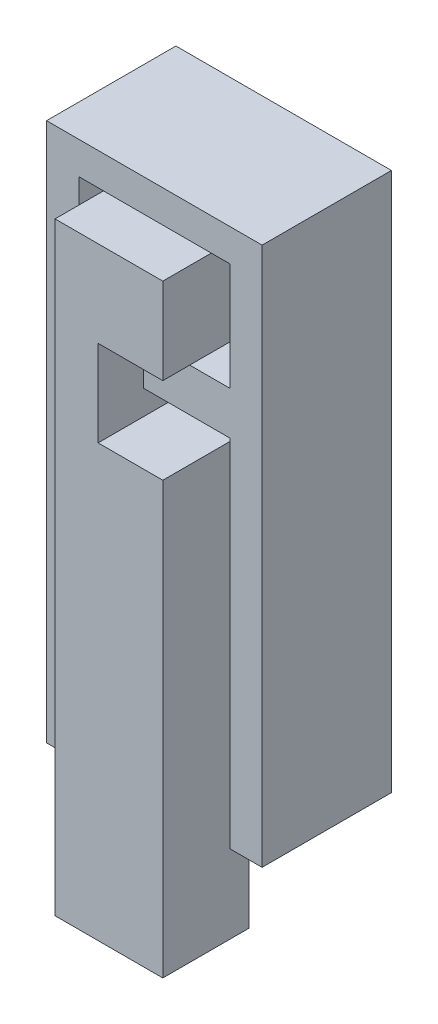
ISO-10303-21;
HEADER;
FILE_DESCRIPTION(('STEP AP214'),'2;1');
FILE_NAME('part.step','',(''),(''),'','','');
FILE_SCHEMA(('AUTOMOTIVE_DESIGN { 1 0 10303 214 1 1 1 1 }'));
ENDSEC;
DATA;
#1=APPLICATION_CONTEXT('core data for automotive mechanical design processes');
#2=APPLICATION_PROTOCOL_DEFINITION('international standard','automotive_design',2000,#1);
#3=PRODUCT_CONTEXT('',#1,'mechanical');
#4=PRODUCT('Part','Part','',(#3));
#5=PRODUCT_RELATED_PRODUCT_CATEGORY('part','',(#4));
#6=PRODUCT_DEFINITION_FORMATION('','',#4);
#7=PRODUCT_DEFINITION_CONTEXT('part definition',#1,'design');
#8=PRODUCT_DEFINITION('design','',#6,#7);
#9=PRODUCT_DEFINITION_SHAPE('','',#8);
#10=(LENGTH_UNIT() NAMED_UNIT(*) SI_UNIT(.MILLI.,.METRE.));
#11=(NAMED_UNIT(*) PLANE_ANGLE_UNIT() SI_UNIT($,.RADIAN.));
#12=(NAMED_UNIT(*) SI_UNIT($,.STERADIAN.) SOLID_ANGLE_UNIT());
#13=UNCERTAINTY_MEASURE_WITH_UNIT(LENGTH_MEASURE(1.E-05),#10,'distance_accuracy_value','');
#14=(GEOMETRIC_REPRESENTATION_CONTEXT(3) GLOBAL_UNCERTAINTY_ASSIGNED_CONTEXT((#13)) GLOBAL_UNIT_ASSIGNED_CONTEXT((#10,
#11,#12)) REPRESENTATION_CONTEXT('',''));
#15=CARTESIAN_POINT('',(0.,0.,0.));
#16=DIRECTION('',(0.,0.,1.));
#17=DIRECTION('',(1.,0.,0.));
#18=AXIS2_PLACEMENT_3D('',#15,#16,#17);
#19=CARTESIAN_POINT('',(-2.82825429201463,16.3201892331112,9.88718147549826));
#20=DIRECTION('',(0.,1.,0.));
#21=DIRECTION('',(0.,0.,1.));
#22=AXIS2_PLACEMENT_3D('',#19,#20,#21);
#23=PLANE('',#22);
#24=DIRECTION('',(1.,0.,0.));
#25=VECTOR('',#24,1.);
#26=CARTESIAN_POINT('',(-2.82825429201463,16.3201892331112,5.88718147549825));
#27=LINE('',#26,#25);
#28=CARTESIAN_POINT('',(-2.82825429201463,16.3201892331112,5.88718147549825));
#29=VERTEX_POINT('',#28);
#30=CARTESIAN_POINT('',(0.171745707985363,16.3201892331112,5.88718147549825));
#31=VERTEX_POINT('',#30);
#32=EDGE_CURVE('E149',#29,#31,#27,.T.);
#33=ORIENTED_EDGE('',*,*,#32,.T.);
#34=DIRECTION('',(0.,0.,-1.));
#35=VECTOR('',#34,1.);
#36=CARTESIAN_POINT('',(0.171745707985363,16.3201892331112,9.88718147549826));
#37=LINE('',#36,#35);
#38=CARTESIAN_POINT('',(0.171745707985363,16.3201892331112,9.88718147549826));
#39=VERTEX_POINT('',#38);
#40=EDGE_CURVE('E12',#39,#31,#37,.T.);
#41=ORIENTED_EDGE('',*,*,#40,.F.);
#42=DIRECTION('',(1.,0.,0.));
#43=VECTOR('',#42,1.);
#44=CARTESIAN_POINT('',(-2.82825429201463,16.3201892331112,9.88718147549826));
#45=LINE('',#44,#43);
#46=CARTESIAN_POINT('',(-2.82825429201463,16.3201892331112,9.88718147549826));
#47=VERTEX_POINT('',#46);
#48=EDGE_CURVE('E164',#47,#39,#45,.T.);
#49=ORIENTED_EDGE('',*,*,#48,.F.);
#50=DIRECTION('',(0.,0.,-1.));
#51=VECTOR('',#50,1.);
#52=CARTESIAN_POINT('',(-2.82825429201463,16.3201892331112,9.88718147549826));
#53=LINE('',#52,#51);
#54=EDGE_CURVE('E145',#47,#29,#53,.T.);
#55=ORIENTED_EDGE('',*,*,#54,.T.);
#56=EDGE_LOOP('',(#33,#41,#49,#55));
#57=FACE_BOUND('',#56,.T.);
#58=ADVANCED_FACE('F53',(#57),#23,.F.);
#59=CARTESIAN_POINT('',(0.171745707985363,16.3201892331112,9.88718147549826));
#60=DIRECTION('',(-1.,0.,0.));
#61=DIRECTION('',(0.,0.,1.));
#62=AXIS2_PLACEMENT_3D('',#59,#60,#61);
#63=PLANE('',#62);
#64=DIRECTION('',(0.,1.,0.));
#65=VECTOR('',#64,1.);
#66=CARTESIAN_POINT('',(0.171745707985363,16.3201892331112,5.88718147549825));
#67=LINE('',#66,#65);
#68=CARTESIAN_POINT('',(0.171745707985363,20.3201892331112,5.88718147549825));
#69=VERTEX_POINT('',#68);
#70=EDGE_CURVE('E152',#31,#69,#67,.T.);
#71=ORIENTED_EDGE('',*,*,#70,.T.);
#72=DIRECTION('',(0.,0.,-1.));
#73=VECTOR('',#72,1.);
#74=CARTESIAN_POINT('',(0.171745707985363,20.3201892331112,9.88718147549826));
#75=LINE('',#74,#73);
#76=CARTESIAN_POINT('',(0.171745707985363,20.3201892331112,9.88718147549826));
#77=VERTEX_POINT('',#76);
#78=EDGE_CURVE('E61',#77,#69,#75,.T.);
#79=ORIENTED_EDGE('',*,*,#78,.F.);
#80=DIRECTION('',(0.,1.,0.));
#81=VECTOR('',#80,1.);
#82=CARTESIAN_POINT('',(0.171745707985363,16.3201892331112,9.88718147549826));
#83=LINE('',#82,#81);
#84=EDGE_CURVE('E112',#39,#77,#83,.T.);
#85=ORIENTED_EDGE('',*,*,#84,.F.);
#86=ORIENTED_EDGE('',*,*,#40,.T.);
#87=EDGE_LOOP('',(#71,#79,#85,#86));
#88=FACE_BOUND('',#87,.T.);
#89=ADVANCED_FACE('F198',(#88),#63,.F.);
#90=CARTESIAN_POINT('',(0.171745707985363,20.3201892331112,9.88718147549826));
#91=DIRECTION('',(0.,-1.,0.));
#92=DIRECTION('',(0.,0.,-1.));
#93=AXIS2_PLACEMENT_3D('',#90,#91,#92);
#94=PLANE('',#93);
#95=DIRECTION('',(-1.,0.,0.));
#96=VECTOR('',#95,1.);
#97=CARTESIAN_POINT('',(0.171745707985363,20.3201892331112,5.88718147549825));
#98=LINE('',#97,#96);
#99=CARTESIAN_POINT('',(-4.82825429201464,20.3201892331112,5.88718147549825));
#100=VERTEX_POINT('',#99);
#101=EDGE_CURVE('E154',#69,#100,#98,.T.);
#102=ORIENTED_EDGE('',*,*,#101,.T.);
#103=DIRECTION('',(0.,0.,-1.));
#104=VECTOR('',#103,1.);
#105=CARTESIAN_POINT('',(-4.82825429201464,20.3201892331112,9.88718147549826));
#106=LINE('',#105,#104);
#107=CARTESIAN_POINT('',(-4.82825429201464,20.3201892331112,9.88718147549826));
#108=VERTEX_POINT('',#107);
#109=EDGE_CURVE('E171',#108,#100,#106,.T.);
#110=ORIENTED_EDGE('',*,*,#109,.F.);
#111=DIRECTION('',(-1.,0.,0.));
#112=VECTOR('',#111,1.);
#113=CARTESIAN_POINT('',(0.171745707985363,20.3201892331112,9.88718147549826));
#114=LINE('',#113,#112);
#115=EDGE_CURVE('E179',#77,#108,#114,.T.);
#116=ORIENTED_EDGE('',*,*,#115,.F.);
#117=ORIENTED_EDGE('',*,*,#78,.T.);
#118=EDGE_LOOP('',(#102,#110,#116,#117));
#119=FACE_BOUND('',#118,.T.);
#120=ADVANCED_FACE('F177',(#119),#94,.F.);
#121=CARTESIAN_POINT('',(-4.82825429201463,0.140546534209612,9.88718147549826));
#122=DIRECTION('',(1.,0.,0.));
#123=DIRECTION('',(0.,1.,0.));
#124=AXIS2_PLACEMENT_3D('',#121,#122,#123);
#125=PLANE('',#124);
#126=DIRECTION('',(0.,-1.,0.));
#127=VECTOR('',#126,1.);
#128=CARTESIAN_POINT('',(-4.82825429201463,0.140546534209612,5.88718147549825));
#129=LINE('',#128,#127);
#130=CARTESIAN_POINT('',(-4.82825429201463,-7.6798107668888,5.88718147549825));
#131=VERTEX_POINT('',#130);
#132=EDGE_CURVE('E157',#100,#131,#129,.T.);
#133=ORIENTED_EDGE('',*,*,#132,.T.);
#134=DIRECTION('',(0.,0.,-1.));
#135=VECTOR('',#134,1.);
#136=CARTESIAN_POINT('',(-4.82825429201463,-7.6798107668888,9.88718147549826));
#137=LINE('',#136,#135);
#138=CARTESIAN_POINT('',(-4.82825429201463,-7.6798107668888,9.88718147549826));
#139=VERTEX_POINT('',#138);
#140=EDGE_CURVE('E168',#139,#131,#137,.T.);
#141=ORIENTED_EDGE('',*,*,#140,.F.);
#142=DIRECTION('',(0.,-1.,0.));
#143=VECTOR('',#142,1.);
#144=CARTESIAN_POINT('',(-4.82825429201464,20.3201892331112,9.88718147549826));
#145=LINE('',#144,#143);
#146=EDGE_CURVE('E190',#108,#139,#145,.T.);
#147=ORIENTED_EDGE('',*,*,#146,.F.);
#148=ORIENTED_EDGE('',*,*,#109,.T.);
#149=EDGE_LOOP('',(#133,#141,#147,#148));
#150=FACE_BOUND('',#149,.T.);
#151=ADVANCED_FACE('F186',(#150),#125,.F.);
#152=CARTESIAN_POINT('',(-4.82825429201463,-7.6798107668888,9.88718147549826));
#153=DIRECTION('',(0.,1.,0.));
#154=DIRECTION('',(0.,0.,1.));
#155=AXIS2_PLACEMENT_3D('',#152,#153,#154);
#156=PLANE('',#155);
#157=DIRECTION('',(1.,0.,0.));
#158=VECTOR('',#157,1.);
#159=CARTESIAN_POINT('',(-4.82825429201463,-7.6798107668888,5.88718147549825));
#160=LINE('',#159,#158);
#161=CARTESIAN_POINT('',(0.171745707985367,-7.6798107668888,5.88718147549825));
#162=VERTEX_POINT('',#161);
#163=EDGE_CURVE('E159',#131,#162,#160,.T.);
#164=ORIENTED_EDGE('',*,*,#163,.T.);
#165=DIRECTION('',(0.,0.,-1.));
#166=VECTOR('',#165,1.);
#167=CARTESIAN_POINT('',(0.171745707985367,-7.6798107668888,9.88718147549826));
#168=LINE('',#167,#166);
#169=CARTESIAN_POINT('',(0.171745707985367,-7.6798107668888,9.88718147549826));
#170=VERTEX_POINT('',#169);
#171=EDGE_CURVE('E140',#170,#162,#168,.T.);
#172=ORIENTED_EDGE('',*,*,#171,.F.);
#173=DIRECTION('',(1.,0.,0.));
#174=VECTOR('',#173,1.);
#175=CARTESIAN_POINT('',(-4.82825429201463,-7.6798107668888,9.88718147549826));
#176=LINE('',#175,#174);
#177=EDGE_CURVE('E131',#139,#170,#176,.T.);
#178=ORIENTED_EDGE('',*,*,#177,.F.);
#179=ORIENTED_EDGE('',*,*,#140,.T.);
#180=EDGE_LOOP('',(#164,#172,#178,#179));
#181=FACE_BOUND('',#180,.T.);
#182=ADVANCED_FACE('F189',(#181),#156,.F.);
#183=CARTESIAN_POINT('',(0.171745707985367,-7.6798107668888,9.88718147549826));
#184=DIRECTION('',(-1.,0.,0.));
#185=DIRECTION('',(0.,0.,1.));
#186=AXIS2_PLACEMENT_3D('',#183,#184,#185);
#187=PLANE('',#186);
#188=DIRECTION('',(0.,1.,0.));
#189=VECTOR('',#188,1.);
#190=CARTESIAN_POINT('',(0.171745707985367,-7.6798107668888,5.88718147549825));
#191=LINE('',#190,#189);
#192=CARTESIAN_POINT('',(0.171745707985367,12.3201892331112,5.88718147549825));
#193=VERTEX_POINT('',#192);
#194=EDGE_CURVE('E139',#162,#193,#191,.T.);
#195=ORIENTED_EDGE('',*,*,#194,.T.);
#196=DIRECTION('',(0.,0.,-1.));
#197=VECTOR('',#196,1.);
#198=CARTESIAN_POINT('',(0.171745707985367,12.3201892331112,9.88718147549826));
#199=LINE('',#198,#197);
#200=CARTESIAN_POINT('',(0.171745707985367,12.3201892331112,9.88718147549826));
#201=VERTEX_POINT('',#200);
#202=EDGE_CURVE('E136',#201,#193,#199,.T.);
#203=ORIENTED_EDGE('',*,*,#202,.F.);
#204=DIRECTION('',(0.,1.,0.));
#205=VECTOR('',#204,1.);
#206=CARTESIAN_POINT('',(0.171745707985367,-7.6798107668888,9.88718147549826));
#207=LINE('',#206,#205);
#208=EDGE_CURVE('E125',#170,#201,#207,.T.);
#209=ORIENTED_EDGE('',*,*,#208,.F.);
#210=ORIENTED_EDGE('',*,*,#171,.T.);
#211=EDGE_LOOP('',(#195,#203,#209,#210));
#212=FACE_BOUND('',#211,.T.);
#213=ADVANCED_FACE('F137',(#212),#187,.F.);
#214=CARTESIAN_POINT('',(0.171745707985367,12.3201892331112,9.88718147549826));
#215=DIRECTION('',(0.,-1.,0.));
#216=DIRECTION('',(0.,0.,-1.));
#217=AXIS2_PLACEMENT_3D('',#214,#215,#216);
#218=PLANE('',#217);
#219=DIRECTION('',(-1.,0.,0.));
#220=VECTOR('',#219,1.);
#221=CARTESIAN_POINT('',(0.171745707985367,12.3201892331112,5.88718147549825));
#222=LINE('',#221,#220);
#223=CARTESIAN_POINT('',(-2.82825429201463,12.3201892331112,5.88718147549825));
#224=VERTEX_POINT('',#223);
#225=EDGE_CURVE('E98',#193,#224,#222,.T.);
#226=ORIENTED_EDGE('',*,*,#225,.T.);
#227=DIRECTION('',(0.,0.,-1.));
#228=VECTOR('',#227,1.);
#229=CARTESIAN_POINT('',(-2.82825429201463,12.3201892331112,9.88718147549826));
#230=LINE('',#229,#228);
#231=CARTESIAN_POINT('',(-2.82825429201463,12.3201892331112,9.88718147549826));
#232=VERTEX_POINT('',#231);
#233=EDGE_CURVE('E141',#232,#224,#230,.T.);
#234=ORIENTED_EDGE('',*,*,#233,.F.);
#235=DIRECTION('',(-1.,0.,0.));
#236=VECTOR('',#235,1.);
#237=CARTESIAN_POINT('',(0.171745707985367,12.3201892331112,9.88718147549826));
#238=LINE('',#237,#236);
#239=EDGE_CURVE('E129',#201,#232,#238,.T.);
#240=ORIENTED_EDGE('',*,*,#239,.F.);
#241=ORIENTED_EDGE('',*,*,#202,.T.);
#242=EDGE_LOOP('',(#226,#234,#240,#241));
#243=FACE_BOUND('',#242,.T.);
#244=ADVANCED_FACE('F143',(#243),#218,.F.);
#245=CARTESIAN_POINT('',(-2.82825429201463,12.3201892331112,9.88718147549826));
#246=DIRECTION('',(-1.,0.,0.));
#247=DIRECTION('',(0.,-1.,0.));
#248=AXIS2_PLACEMENT_3D('',#245,#246,#247);
#249=PLANE('',#248);
#250=DIRECTION('',(0.,1.,0.));
#251=VECTOR('',#250,1.);
#252=CARTESIAN_POINT('',(-2.82825429201463,12.3201892331112,5.88718147549825));
#253=LINE('',#252,#251);
#254=EDGE_CURVE('E104',#224,#29,#253,.T.);
#255=ORIENTED_EDGE('',*,*,#254,.T.);
#256=ORIENTED_EDGE('',*,*,#54,.F.);
#257=DIRECTION('',(0.,1.,0.));
#258=VECTOR('',#257,1.);
#259=CARTESIAN_POINT('',(-2.82825429201463,12.3201892331112,9.88718147549826));
#260=LINE('',#259,#258);
#261=EDGE_CURVE('E69',#232,#47,#260,.T.);
#262=ORIENTED_EDGE('',*,*,#261,.F.);
#263=ORIENTED_EDGE('',*,*,#233,.T.);
#264=EDGE_LOOP('',(#255,#256,#262,#263));
#265=FACE_BOUND('',#264,.T.);
#266=ADVANCED_FACE('F214',(#265),#249,.F.);
#267=CARTESIAN_POINT('',(0.,0.,9.88718147549826));
#268=DIRECTION('',(0.,0.,1.));
#269=DIRECTION('',(1.,0.,0.));
#270=AXIS2_PLACEMENT_3D('',#267,#268,#269);
#271=PLANE('',#270);
#272=ORIENTED_EDGE('',*,*,#48,.T.);
#273=ORIENTED_EDGE('',*,*,#84,.T.);
#274=ORIENTED_EDGE('',*,*,#115,.T.);
#275=ORIENTED_EDGE('',*,*,#146,.T.);
#276=ORIENTED_EDGE('',*,*,#177,.T.);
#277=ORIENTED_EDGE('',*,*,#208,.T.);
#278=ORIENTED_EDGE('',*,*,#239,.T.);
#279=ORIENTED_EDGE('',*,*,#261,.T.);
#280=EDGE_LOOP('',(#272,#273,#274,#275,#276,#277,#278,#279));
#281=FACE_BOUND('',#280,.T.);
#282=ADVANCED_FACE('F127',(#281),#271,.T.);
#283=CARTESIAN_POINT('',(0.,0.,5.88718147549825));
#284=DIRECTION('',(0.,0.,1.));
#285=DIRECTION('',(1.,0.,0.));
#286=AXIS2_PLACEMENT_3D('',#283,#284,#285);
#287=PLANE('',#286);
#288=ORIENTED_EDGE('',*,*,#32,.F.);
#289=ORIENTED_EDGE('',*,*,#254,.F.);
#290=ORIENTED_EDGE('',*,*,#225,.F.);
#291=ORIENTED_EDGE('',*,*,#194,.F.);
#292=ORIENTED_EDGE('',*,*,#163,.F.);
#293=ORIENTED_EDGE('',*,*,#132,.F.);
#294=ORIENTED_EDGE('',*,*,#101,.F.);
#295=ORIENTED_EDGE('',*,*,#70,.F.);
#296=EDGE_LOOP('',(#288,#289,#290,#291,#292,#293,#294,#295));
#297=FACE_BOUND('',#296,.T.);
#298=ADVANCED_FACE('F182',(#297),#287,.F.);
#299=CLOSED_SHELL('',(#58,#89,#120,#151,#182,#213,#244,#266,#282,#298));
#300=MANIFOLD_SOLID_BREP('B2',#299);
#301=CARTESIAN_POINT('',(-5.22095371119855,-0.930481442454931,8.38718147549826));
#302=DIRECTION('',(0.,0.,-1.));
#303=DIRECTION('',(-1.,0.,0.));
#304=AXIS2_PLACEMENT_3D('',#301,#302,#303);
#305=PLANE('',#304);
#306=DIRECTION('',(1.,0.,0.));
#307=VECTOR('',#306,1.);
#308=CARTESIAN_POINT('',(-6.72095371119854,-2.43048144245493,8.38718147549826));
#309=LINE('',#308,#307);
#310=CARTESIAN_POINT('',(-6.72095371119854,-2.43048144245493,8.38718147549826));
#311=VERTEX_POINT('',#310);
#312=CARTESIAN_POINT('',(-5.22095371119855,-2.43048144245493,8.38718147549826));
#313=VERTEX_POINT('',#312);
#314=EDGE_CURVE('E425',#311,#313,#309,.T.);
#315=ORIENTED_EDGE('',*,*,#314,.T.);
#316=DIRECTION('',(0.,-1.,0.));
#317=VECTOR('',#316,1.);
#318=CARTESIAN_POINT('',(-5.22095371119855,-0.930481442454931,8.38718147549826));
#319=LINE('',#318,#317);
#320=CARTESIAN_POINT('',(-5.22095371119855,21.0695185575451,8.38718147549826));
#321=VERTEX_POINT('',#320);
#322=EDGE_CURVE('E411',#321,#313,#319,.T.);
#323=ORIENTED_EDGE('',*,*,#322,.F.);
#324=DIRECTION('',(-1.,0.,0.));
#325=VECTOR('',#324,1.);
#326=CARTESIAN_POINT('',(-5.22095371119855,21.0695185575451,8.38718147549826));
#327=LINE('',#326,#325);
#328=CARTESIAN_POINT('',(1.77904628880146,21.0695185575451,8.38718147549826));
#329=VERTEX_POINT('',#328);
#330=EDGE_CURVE('E481',#329,#321,#327,.T.);
#331=ORIENTED_EDGE('',*,*,#330,.F.);
#332=DIRECTION('',(0.,1.,0.));
#333=VECTOR('',#332,1.);
#334=CARTESIAN_POINT('',(1.77904628880146,16.0695185575451,8.38718147549826));
#335=LINE('',#334,#333);
#336=CARTESIAN_POINT('',(1.77904628880146,16.0695185575451,8.38718147549826));
#337=VERTEX_POINT('',#336);
#338=EDGE_CURVE('E479',#337,#329,#335,.T.);
#339=ORIENTED_EDGE('',*,*,#338,.F.);
#340=DIRECTION('',(1.,0.,0.));
#341=VECTOR('',#340,1.);
#342=CARTESIAN_POINT('',(1.77904628880146,16.0695185575451,8.38718147549826));
#343=LINE('',#342,#341);
#344=CARTESIAN_POINT('',(-2.22095371119855,16.0695185575451,8.38718147549826));
#345=VERTEX_POINT('',#344);
#346=EDGE_CURVE('E477',#345,#337,#343,.T.);
#347=ORIENTED_EDGE('',*,*,#346,.F.);
#348=DIRECTION('',(0.,1.,0.));
#349=VECTOR('',#348,1.);
#350=CARTESIAN_POINT('',(-2.22095371119855,16.0695185575451,8.38718147549826));
#351=LINE('',#350,#349);
#352=CARTESIAN_POINT('',(-2.22095371119854,14.0695185575451,8.38718147549826));
#353=VERTEX_POINT('',#352);
#354=EDGE_CURVE('E475',#353,#345,#351,.T.);
#355=ORIENTED_EDGE('',*,*,#354,.F.);
#356=DIRECTION('',(-1.,0.,0.));
#357=VECTOR('',#356,1.);
#358=CARTESIAN_POINT('',(-2.22095371119854,14.0695185575451,8.38718147549826));
#359=LINE('',#358,#357);
#360=CARTESIAN_POINT('',(1.77904628880146,14.0695185575451,8.38718147549826));
#361=VERTEX_POINT('',#360);
#362=EDGE_CURVE('E473',#361,#353,#359,.T.);
#363=ORIENTED_EDGE('',*,*,#362,.F.);
#364=DIRECTION('',(0.,1.,0.));
#365=VECTOR('',#364,1.);
#366=CARTESIAN_POINT('',(1.77904628880146,-0.930481442454931,8.38718147549826));
#367=LINE('',#366,#365);
#368=CARTESIAN_POINT('',(1.77904628880146,-2.43048144245493,8.38718147549826));
#369=VERTEX_POINT('',#368);
#370=EDGE_CURVE('E420',#369,#361,#367,.T.);
#371=ORIENTED_EDGE('',*,*,#370,.F.);
#372=CARTESIAN_POINT('',(3.27904628880146,-2.43048144245493,8.38718147549826));
#373=VERTEX_POINT('',#372);
#374=EDGE_CURVE('E436',#369,#373,#309,.T.);
#375=ORIENTED_EDGE('',*,*,#374,.T.);
#376=DIRECTION('',(0.,1.,0.));
#377=VECTOR('',#376,1.);
#378=CARTESIAN_POINT('',(3.27904628880146,-2.43048144245493,8.38718147549826));
#379=LINE('',#378,#377);
#380=CARTESIAN_POINT('',(3.27904628880146,22.5695185575451,8.38718147549826));
#381=VERTEX_POINT('',#380);
#382=EDGE_CURVE('E435',#373,#381,#379,.T.);
#383=ORIENTED_EDGE('',*,*,#382,.T.);
#384=DIRECTION('',(-1.,0.,0.));
#385=VECTOR('',#384,1.);
#386=CARTESIAN_POINT('',(-6.72095371119854,22.5695185575451,8.38718147549826));
#387=LINE('',#386,#385);
#388=CARTESIAN_POINT('',(-6.72095371119854,22.5695185575451,8.38718147549826));
#389=VERTEX_POINT('',#388);
#390=EDGE_CURVE('E438',#381,#389,#387,.T.);
#391=ORIENTED_EDGE('',*,*,#390,.T.);
#392=DIRECTION('',(0.,-1.,0.));
#393=VECTOR('',#392,1.);
#394=CARTESIAN_POINT('',(-6.72095371119854,-2.43048144245493,8.38718147549826));
#395=LINE('',#394,#393);
#396=EDGE_CURVE('E433',#389,#311,#395,.T.);
#397=ORIENTED_EDGE('',*,*,#396,.T.);
#398=EDGE_LOOP('',(#315,#323,#331,#339,#347,#355,#363,#371,#375,#383,#391,#397));
#399=FACE_BOUND('',#398,.T.);
#400=ADVANCED_FACE('F324',(#399),#305,.F.);
#401=CARTESIAN_POINT('',(-6.72095371119854,-2.43048144245493,8.38718147549826));
#402=DIRECTION('',(1.,0.,0.));
#403=DIRECTION('',(0.,0.,-1.));
#404=AXIS2_PLACEMENT_3D('',#401,#402,#403);
#405=PLANE('',#404);
#406=DIRECTION('',(0.,0.,-1.));
#407=VECTOR('',#406,1.);
#408=CARTESIAN_POINT('',(-6.72095371119854,22.5695185575451,8.38718147549826));
#409=LINE('',#408,#407);
#410=CARTESIAN_POINT('',(-6.72095371119854,22.5695185575451,2.38718147549825));
#411=VERTEX_POINT('',#410);
#412=EDGE_CURVE('E444',#389,#411,#409,.T.);
#413=ORIENTED_EDGE('',*,*,#412,.T.);
#414=DIRECTION('',(0.,1.,0.));
#415=VECTOR('',#414,1.);
#416=CARTESIAN_POINT('',(-6.72095371119854,22.5695185575451,2.38718147549825));
#417=LINE('',#416,#415);
#418=CARTESIAN_POINT('',(-6.72095371119854,-2.43048144245493,2.38718147549825));
#419=VERTEX_POINT('',#418);
#420=EDGE_CURVE('E461',#419,#411,#417,.T.);
#421=ORIENTED_EDGE('',*,*,#420,.F.);
#422=DIRECTION('',(0.,0.,-1.));
#423=VECTOR('',#422,1.);
#424=CARTESIAN_POINT('',(-6.72095371119854,-2.43048144245493,8.38718147549826));
#425=LINE('',#424,#423);
#426=EDGE_CURVE('E51',#311,#419,#425,.T.);
#427=ORIENTED_EDGE('',*,*,#426,.F.);
#428=ORIENTED_EDGE('',*,*,#396,.F.);
#429=EDGE_LOOP('',(#413,#421,#427,#428));
#430=FACE_BOUND('',#429,.T.);
#431=ADVANCED_FACE('F326',(#430),#405,.F.);
#432=CARTESIAN_POINT('',(-6.72095371119854,-2.43048144245493,8.38718147549826));
#433=DIRECTION('',(0.,1.,0.));
#434=DIRECTION('',(0.,0.,1.));
#435=AXIS2_PLACEMENT_3D('',#432,#433,#434);
#436=PLANE('',#435);
#437=DIRECTION('',(-1.,0.,0.));
#438=VECTOR('',#437,1.);
#439=CARTESIAN_POINT('',(-6.72095371119854,-2.43048144245493,3.38718147549825));
#440=LINE('',#439,#438);
#441=CARTESIAN_POINT('',(1.77904628880146,-2.43048144245493,3.38718147549825));
#442=VERTEX_POINT('',#441);
#443=CARTESIAN_POINT('',(-5.22095371119855,-2.43048144245493,3.38718147549825));
#444=VERTEX_POINT('',#443);
#445=EDGE_CURVE('E429',#442,#444,#440,.T.);
#446=ORIENTED_EDGE('',*,*,#445,.T.);
#447=DIRECTION('',(0.,0.,1.));
#448=VECTOR('',#447,1.);
#449=CARTESIAN_POINT('',(-5.22095371119855,-2.43048144245493,8.38718147549826));
#450=LINE('',#449,#448);
#451=EDGE_CURVE('E414',#444,#313,#450,.T.);
#452=ORIENTED_EDGE('',*,*,#451,.T.);
#453=ORIENTED_EDGE('',*,*,#314,.F.);
#454=ORIENTED_EDGE('',*,*,#426,.T.);
#455=DIRECTION('',(-1.,0.,0.));
#456=VECTOR('',#455,1.);
#457=CARTESIAN_POINT('',(3.27904628880146,-2.43048144245493,2.38718147549825));
#458=LINE('',#457,#456);
#459=CARTESIAN_POINT('',(3.27904628880146,-2.43048144245493,2.38718147549825));
#460=VERTEX_POINT('',#459);
#461=EDGE_CURVE('E457',#460,#419,#458,.T.);
#462=ORIENTED_EDGE('',*,*,#461,.F.);
#463=DIRECTION('',(0.,0.,-1.));
#464=VECTOR('',#463,1.);
#465=CARTESIAN_POINT('',(3.27904628880146,-2.43048144245493,8.38718147549826));
#466=LINE('',#465,#464);
#467=EDGE_CURVE('E332',#373,#460,#466,.T.);
#468=ORIENTED_EDGE('',*,*,#467,.F.);
#469=ORIENTED_EDGE('',*,*,#374,.F.);
#470=DIRECTION('',(0.,0.,-1.));
#471=VECTOR('',#470,1.);
#472=CARTESIAN_POINT('',(1.77904628880146,-2.43048144245493,8.38718147549826));
#473=LINE('',#472,#471);
#474=EDGE_CURVE('E521',#369,#442,#473,.T.);
#475=ORIENTED_EDGE('',*,*,#474,.T.);
#476=EDGE_LOOP('',(#446,#452,#453,#454,#462,#468,#469,#475));
#477=FACE_BOUND('',#476,.T.);
#478=ADVANCED_FACE('F424',(#477),#436,.F.);
#479=CARTESIAN_POINT('',(3.27904628880146,-2.43048144245493,8.38718147549826));
#480=DIRECTION('',(-1.,0.,0.));
#481=DIRECTION('',(0.,0.,1.));
#482=AXIS2_PLACEMENT_3D('',#479,#480,#481);
#483=PLANE('',#482);
#484=ORIENTED_EDGE('',*,*,#467,.T.);
#485=DIRECTION('',(0.,-1.,0.));
#486=VECTOR('',#485,1.);
#487=CARTESIAN_POINT('',(3.27904628880146,22.5695185575451,2.38718147549825));
#488=LINE('',#487,#486);
#489=CARTESIAN_POINT('',(3.27904628880146,22.5695185575451,2.38718147549825));
#490=VERTEX_POINT('',#489);
#491=EDGE_CURVE('E430',#490,#460,#488,.T.);
#492=ORIENTED_EDGE('',*,*,#491,.F.);
#493=DIRECTION('',(0.,0.,-1.));
#494=VECTOR('',#493,1.);
#495=CARTESIAN_POINT('',(3.27904628880146,22.5695185575451,8.38718147549826));
#496=LINE('',#495,#494);
#497=EDGE_CURVE('E446',#381,#490,#496,.T.);
#498=ORIENTED_EDGE('',*,*,#497,.F.);
#499=ORIENTED_EDGE('',*,*,#382,.F.);
#500=EDGE_LOOP('',(#484,#492,#498,#499));
#501=FACE_BOUND('',#500,.T.);
#502=ADVANCED_FACE('F452',(#501),#483,.F.);
#503=CARTESIAN_POINT('',(-6.72095371119854,22.5695185575451,8.38718147549826));
#504=DIRECTION('',(0.,-1.,0.));
#505=DIRECTION('',(0.,0.,-1.));
#506=AXIS2_PLACEMENT_3D('',#503,#504,#505);
#507=PLANE('',#506);
#508=ORIENTED_EDGE('',*,*,#497,.T.);
#509=DIRECTION('',(1.,0.,0.));
#510=VECTOR('',#509,1.);
#511=CARTESIAN_POINT('',(3.27904628880146,22.5695185575451,2.38718147549825));
#512=LINE('',#511,#510);
#513=EDGE_CURVE('E466',#411,#490,#512,.T.);
#514=ORIENTED_EDGE('',*,*,#513,.F.);
#515=ORIENTED_EDGE('',*,*,#412,.F.);
#516=ORIENTED_EDGE('',*,*,#390,.F.);
#517=EDGE_LOOP('',(#508,#514,#515,#516));
#518=FACE_BOUND('',#517,.T.);
#519=ADVANCED_FACE('F554',(#518),#507,.F.);
#520=CARTESIAN_POINT('',(-5.22095371119855,-0.930481442454931,8.38718147549826));
#521=DIRECTION('',(1.,0.,0.));
#522=DIRECTION('',(0.,0.,-1.));
#523=AXIS2_PLACEMENT_3D('',#520,#521,#522);
#524=PLANE('',#523);
#525=DIRECTION('',(0.,-1.,0.));
#526=VECTOR('',#525,1.);
#527=CARTESIAN_POINT('',(-5.22095371119855,-0.930481442454931,3.38718147549825));
#528=LINE('',#527,#526);
#529=CARTESIAN_POINT('',(-5.22095371119855,21.0695185575451,3.38718147549825));
#530=VERTEX_POINT('',#529);
#531=EDGE_CURVE('E347',#530,#444,#528,.T.);
#532=ORIENTED_EDGE('',*,*,#531,.F.);
#533=DIRECTION('',(0.,0.,-1.));
#534=VECTOR('',#533,1.);
#535=CARTESIAN_POINT('',(-5.22095371119855,21.0695185575451,8.38718147549826));
#536=LINE('',#535,#534);
#537=EDGE_CURVE('E416',#321,#530,#536,.T.);
#538=ORIENTED_EDGE('',*,*,#537,.F.);
#539=ORIENTED_EDGE('',*,*,#322,.T.);
#540=ORIENTED_EDGE('',*,*,#451,.F.);
#541=EDGE_LOOP('',(#532,#538,#539,#540));
#542=FACE_BOUND('',#541,.T.);
#543=ADVANCED_FACE('F413',(#542),#524,.T.);
#544=CARTESIAN_POINT('',(1.77904628880146,-0.930481442454931,8.38718147549826));
#545=DIRECTION('',(-1.,0.,0.));
#546=DIRECTION('',(0.,0.,1.));
#547=AXIS2_PLACEMENT_3D('',#544,#545,#546);
#548=PLANE('',#547);
#549=DIRECTION('',(0.,1.,0.));
#550=VECTOR('',#549,1.);
#551=CARTESIAN_POINT('',(1.77904628880146,-0.930481442454931,3.38718147549825));
#552=LINE('',#551,#550);
#553=CARTESIAN_POINT('',(1.77904628880146,14.0695185575451,3.38718147549825));
#554=VERTEX_POINT('',#553);
#555=EDGE_CURVE('E484',#442,#554,#552,.T.);
#556=ORIENTED_EDGE('',*,*,#555,.F.);
#557=ORIENTED_EDGE('',*,*,#474,.F.);
#558=ORIENTED_EDGE('',*,*,#370,.T.);
#559=DIRECTION('',(0.,0.,-1.));
#560=VECTOR('',#559,1.);
#561=CARTESIAN_POINT('',(1.77904628880146,14.0695185575451,8.38718147549826));
#562=LINE('',#561,#560);
#563=EDGE_CURVE('E508',#361,#554,#562,.T.);
#564=ORIENTED_EDGE('',*,*,#563,.T.);
#565=EDGE_LOOP('',(#556,#557,#558,#564));
#566=FACE_BOUND('',#565,.T.);
#567=ADVANCED_FACE('F512',(#566),#548,.T.);
#568=CARTESIAN_POINT('',(-2.22095371119854,14.0695185575451,8.38718147549826));
#569=DIRECTION('',(0.,-1.,0.));
#570=DIRECTION('',(0.,0.,-1.));
#571=AXIS2_PLACEMENT_3D('',#568,#569,#570);
#572=PLANE('',#571);
#573=DIRECTION('',(-1.,0.,0.));
#574=VECTOR('',#573,1.);
#575=CARTESIAN_POINT('',(-2.22095371119854,14.0695185575451,3.38718147549825));
#576=LINE('',#575,#574);
#577=CARTESIAN_POINT('',(-2.22095371119854,14.0695185575451,3.38718147549825));
#578=VERTEX_POINT('',#577);
#579=EDGE_CURVE('E487',#554,#578,#576,.T.);
#580=ORIENTED_EDGE('',*,*,#579,.F.);
#581=ORIENTED_EDGE('',*,*,#563,.F.);
#582=ORIENTED_EDGE('',*,*,#362,.T.);
#583=DIRECTION('',(0.,0.,-1.));
#584=VECTOR('',#583,1.);
#585=CARTESIAN_POINT('',(-2.22095371119854,14.0695185575451,8.38718147549826));
#586=LINE('',#585,#584);
#587=EDGE_CURVE('E507',#353,#578,#586,.T.);
#588=ORIENTED_EDGE('',*,*,#587,.T.);
#589=EDGE_LOOP('',(#580,#581,#582,#588));
#590=FACE_BOUND('',#589,.T.);
#591=ADVANCED_FACE('F516',(#590),#572,.T.);
#592=CARTESIAN_POINT('',(-2.22095371119855,16.0695185575451,8.38718147549826));
#593=DIRECTION('',(-1.,0.,0.));
#594=DIRECTION('',(0.,-1.,0.));
#595=AXIS2_PLACEMENT_3D('',#592,#593,#594);
#596=PLANE('',#595);
#597=DIRECTION('',(0.,1.,0.));
#598=VECTOR('',#597,1.);
#599=CARTESIAN_POINT('',(-2.22095371119855,16.0695185575451,3.38718147549825));
#600=LINE('',#599,#598);
#601=CARTESIAN_POINT('',(-2.22095371119855,16.0695185575451,3.38718147549825));
#602=VERTEX_POINT('',#601);
#603=EDGE_CURVE('E490',#578,#602,#600,.T.);
#604=ORIENTED_EDGE('',*,*,#603,.F.);
#605=ORIENTED_EDGE('',*,*,#587,.F.);
#606=ORIENTED_EDGE('',*,*,#354,.T.);
#607=DIRECTION('',(0.,0.,-1.));
#608=VECTOR('',#607,1.);
#609=CARTESIAN_POINT('',(-2.22095371119855,16.0695185575451,8.38718147549826));
#610=LINE('',#609,#608);
#611=EDGE_CURVE('E505',#345,#602,#610,.T.);
#612=ORIENTED_EDGE('',*,*,#611,.T.);
#613=EDGE_LOOP('',(#604,#605,#606,#612));
#614=FACE_BOUND('',#613,.T.);
#615=ADVANCED_FACE('F526',(#614),#596,.T.);
#616=CARTESIAN_POINT('',(1.77904628880146,16.0695185575451,8.38718147549826));
#617=DIRECTION('',(0.,1.,0.));
#618=DIRECTION('',(0.,0.,1.));
#619=AXIS2_PLACEMENT_3D('',#616,#617,#618);
#620=PLANE('',#619);
#621=DIRECTION('',(1.,0.,0.));
#622=VECTOR('',#621,1.);
#623=CARTESIAN_POINT('',(1.77904628880146,16.0695185575451,3.38718147549825));
#624=LINE('',#623,#622);
#625=CARTESIAN_POINT('',(1.77904628880146,16.0695185575451,3.38718147549825));
#626=VERTEX_POINT('',#625);
#627=EDGE_CURVE('E493',#602,#626,#624,.T.);
#628=ORIENTED_EDGE('',*,*,#627,.F.);
#629=ORIENTED_EDGE('',*,*,#611,.F.);
#630=ORIENTED_EDGE('',*,*,#346,.T.);
#631=DIRECTION('',(0.,0.,-1.));
#632=VECTOR('',#631,1.);
#633=CARTESIAN_POINT('',(1.77904628880146,16.0695185575451,8.38718147549826));
#634=LINE('',#633,#632);
#635=EDGE_CURVE('E503',#337,#626,#634,.T.);
#636=ORIENTED_EDGE('',*,*,#635,.T.);
#637=EDGE_LOOP('',(#628,#629,#630,#636));
#638=FACE_BOUND('',#637,.T.);
#639=ADVANCED_FACE('F531',(#638),#620,.T.);
#640=CARTESIAN_POINT('',(1.77904628880146,16.0695185575451,8.38718147549826));
#641=DIRECTION('',(-1.,0.,0.));
#642=DIRECTION('',(0.,0.,1.));
#643=AXIS2_PLACEMENT_3D('',#640,#641,#642);
#644=PLANE('',#643);
#645=DIRECTION('',(0.,1.,0.));
#646=VECTOR('',#645,1.);
#647=CARTESIAN_POINT('',(1.77904628880146,16.0695185575451,3.38718147549825));
#648=LINE('',#647,#646);
#649=CARTESIAN_POINT('',(1.77904628880146,21.0695185575451,3.38718147549825));
#650=VERTEX_POINT('',#649);
#651=EDGE_CURVE('E496',#626,#650,#648,.T.);
#652=ORIENTED_EDGE('',*,*,#651,.F.);
#653=ORIENTED_EDGE('',*,*,#635,.F.);
#654=ORIENTED_EDGE('',*,*,#338,.T.);
#655=DIRECTION('',(0.,0.,-1.));
#656=VECTOR('',#655,1.);
#657=CARTESIAN_POINT('',(1.77904628880146,21.0695185575451,8.38718147549826));
#658=LINE('',#657,#656);
#659=EDGE_CURVE('E339',#329,#650,#658,.T.);
#660=ORIENTED_EDGE('',*,*,#659,.T.);
#661=EDGE_LOOP('',(#652,#653,#654,#660));
#662=FACE_BOUND('',#661,.T.);
#663=ADVANCED_FACE('F535',(#662),#644,.T.);
#664=CARTESIAN_POINT('',(-5.22095371119855,21.0695185575451,8.38718147549826));
#665=DIRECTION('',(0.,-1.,0.));
#666=DIRECTION('',(0.,0.,-1.));
#667=AXIS2_PLACEMENT_3D('',#664,#665,#666);
#668=PLANE('',#667);
#669=DIRECTION('',(-1.,0.,0.));
#670=VECTOR('',#669,1.);
#671=CARTESIAN_POINT('',(-5.22095371119855,21.0695185575451,3.38718147549825));
#672=LINE('',#671,#670);
#673=EDGE_CURVE('E421',#650,#530,#672,.T.);
#674=ORIENTED_EDGE('',*,*,#673,.F.);
#675=ORIENTED_EDGE('',*,*,#659,.F.);
#676=ORIENTED_EDGE('',*,*,#330,.T.);
#677=ORIENTED_EDGE('',*,*,#537,.T.);
#678=EDGE_LOOP('',(#674,#675,#676,#677));
#679=FACE_BOUND('',#678,.T.);
#680=ADVANCED_FACE('F536',(#679),#668,.T.);
#681=CARTESIAN_POINT('',(-5.22095371119855,-0.930481442454931,3.38718147549825));
#682=DIRECTION('',(0.,0.,-1.));
#683=DIRECTION('',(-1.,0.,0.));
#684=AXIS2_PLACEMENT_3D('',#681,#682,#683);
#685=PLANE('',#684);
#686=ORIENTED_EDGE('',*,*,#651,.T.);
#687=ORIENTED_EDGE('',*,*,#673,.T.);
#688=ORIENTED_EDGE('',*,*,#531,.T.);
#689=ORIENTED_EDGE('',*,*,#445,.F.);
#690=ORIENTED_EDGE('',*,*,#555,.T.);
#691=ORIENTED_EDGE('',*,*,#579,.T.);
#692=ORIENTED_EDGE('',*,*,#603,.T.);
#693=ORIENTED_EDGE('',*,*,#627,.T.);
#694=EDGE_LOOP('',(#686,#687,#688,#689,#690,#691,#692,#693));
#695=FACE_BOUND('',#694,.T.);
#696=ADVANCED_FACE('F520',(#695),#685,.F.);
#697=CARTESIAN_POINT('',(-5.22095371119855,-0.930481442454931,2.38718147549825));
#698=DIRECTION('',(0.,0.,-1.));
#699=DIRECTION('',(-1.,0.,0.));
#700=AXIS2_PLACEMENT_3D('',#697,#698,#699);
#701=PLANE('',#700);
#702=ORIENTED_EDGE('',*,*,#491,.T.);
#703=ORIENTED_EDGE('',*,*,#461,.T.);
#704=ORIENTED_EDGE('',*,*,#420,.T.);
#705=ORIENTED_EDGE('',*,*,#513,.T.);
#706=EDGE_LOOP('',(#702,#703,#704,#705));
#707=FACE_BOUND('',#706,.T.);
#708=ADVANCED_FACE('F464',(#707),#701,.T.);
#709=CLOSED_SHELL('',(#400,#431,#478,#502,#519,#543,#567,#591,#615,#639,#663,#680,#696,#708));
#710=MANIFOLD_SOLID_BREP('B6',#709);
#711=ADVANCED_BREP_SHAPE_REPRESENTATION('',(#18,#300,#710),#14);
#712=SHAPE_DEFINITION_REPRESENTATION(#9,#711);
ENDSEC;
END-ISO-10303-21;
